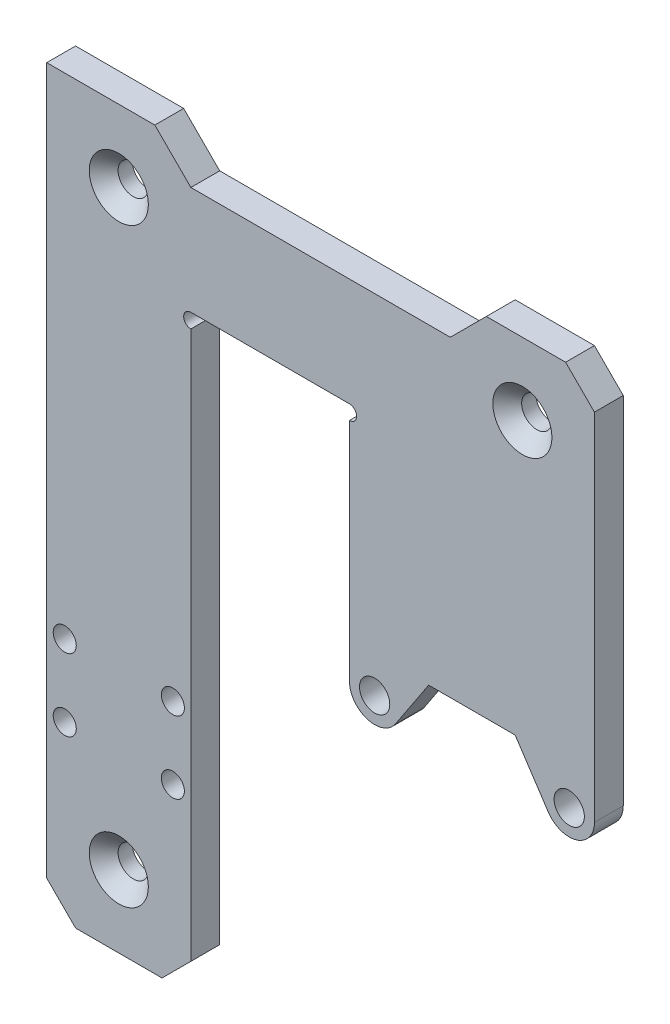
ISO-10303-21;
HEADER;
FILE_DESCRIPTION(('STEP AP214'),'2;1');
FILE_NAME('part.step','',(''),(''),'','','');
FILE_SCHEMA(('AUTOMOTIVE_DESIGN { 1 0 10303 214 1 1 1 1 }'));
ENDSEC;
DATA;
#1=APPLICATION_CONTEXT('core data for automotive mechanical design processes');
#2=APPLICATION_PROTOCOL_DEFINITION('international standard','automotive_design',2000,#1);
#3=PRODUCT_CONTEXT('',#1,'mechanical');
#4=PRODUCT('Part','Part','',(#3));
#5=PRODUCT_RELATED_PRODUCT_CATEGORY('part','',(#4));
#6=PRODUCT_DEFINITION_FORMATION('','',#4);
#7=PRODUCT_DEFINITION_CONTEXT('part definition',#1,'design');
#8=PRODUCT_DEFINITION('design','',#6,#7);
#9=PRODUCT_DEFINITION_SHAPE('','',#8);
#10=(LENGTH_UNIT() NAMED_UNIT(*) SI_UNIT(.MILLI.,.METRE.));
#11=(NAMED_UNIT(*) PLANE_ANGLE_UNIT() SI_UNIT($,.RADIAN.));
#12=(NAMED_UNIT(*) SI_UNIT($,.STERADIAN.) SOLID_ANGLE_UNIT());
#13=UNCERTAINTY_MEASURE_WITH_UNIT(LENGTH_MEASURE(1.E-05),#10,'distance_accuracy_value','');
#14=(GEOMETRIC_REPRESENTATION_CONTEXT(3) GLOBAL_UNCERTAINTY_ASSIGNED_CONTEXT((#13)) GLOBAL_UNIT_ASSIGNED_CONTEXT((#10,
#11,#12)) REPRESENTATION_CONTEXT('',''));
#15=CARTESIAN_POINT('',(0.,0.,0.));
#16=DIRECTION('',(0.,0.,1.));
#17=DIRECTION('',(1.,0.,0.));
#18=AXIS2_PLACEMENT_3D('',#15,#16,#17);
#19=CARTESIAN_POINT('',(45.,20.,2.));
#20=DIRECTION('',(0.,-1.,0.));
#21=DIRECTION('',(1.,0.,0.));
#22=AXIS2_PLACEMENT_3D('',#19,#20,#21);
#23=PLANE('',#22);
#24=DIRECTION('',(-1.,0.,0.));
#25=VECTOR('',#24,1.);
#26=CARTESIAN_POINT('',(45.,20.,2.));
#27=LINE('',#26,#25);
#28=CARTESIAN_POINT('',(41.,20.,2.));
#29=VERTEX_POINT('',#28);
#30=CARTESIAN_POINT('',(30.0000000000001,20.,2.));
#31=VERTEX_POINT('',#30);
#32=EDGE_CURVE('E265',#29,#31,#27,.T.);
#33=ORIENTED_EDGE('',*,*,#32,.F.);
#34=DIRECTION('',(0.,0.,-1.));
#35=VECTOR('',#34,1.);
#36=CARTESIAN_POINT('',(41.,20.,2.));
#37=LINE('',#36,#35);
#38=CARTESIAN_POINT('',(41.,20.,-2.));
#39=VERTEX_POINT('',#38);
#40=EDGE_CURVE('E48',#29,#39,#37,.T.);
#41=ORIENTED_EDGE('',*,*,#40,.T.);
#42=DIRECTION('',(-1.,0.,0.));
#43=VECTOR('',#42,1.);
#44=CARTESIAN_POINT('',(45.,20.,-2.));
#45=LINE('',#44,#43);
#46=CARTESIAN_POINT('',(30.0000000000001,20.,-2.));
#47=VERTEX_POINT('',#46);
#48=EDGE_CURVE('E263',#39,#47,#45,.T.);
#49=ORIENTED_EDGE('',*,*,#48,.T.);
#50=DIRECTION('',(0.,0.,1.));
#51=VECTOR('',#50,1.);
#52=CARTESIAN_POINT('',(30.0000000000001,20.,-2.));
#53=LINE('',#52,#51);
#54=EDGE_CURVE('E502',#47,#31,#53,.T.);
#55=ORIENTED_EDGE('',*,*,#54,.T.);
#56=EDGE_LOOP('',(#33,#41,#49,#55));
#57=FACE_BOUND('',#56,.T.);
#58=ADVANCED_FACE('F39',(#57),#23,.F.);
#59=CARTESIAN_POINT('',(41.5,-33.3065622090011,2.));
#60=DIRECTION('',(0.,0.,1.));
#61=DIRECTION('',(1.,0.,0.));
#62=AXIS2_PLACEMENT_3D('',#59,#60,#61);
#63=PLANE('',#62);
#64=CARTESIAN_POINT('',(-13.5,-58.,2.));
#65=DIRECTION('',(0.,0.,1.));
#66=DIRECTION('',(1.,0.,0.));
#67=AXIS2_PLACEMENT_3D('',#64,#65,#66);
#68=CIRCLE('',#67,1.6);
#69=CARTESIAN_POINT('',(-11.9,-58.,2.));
#70=VERTEX_POINT('',#69);
#71=EDGE_CURVE('E567',#70,#70,#68,.T.);
#72=ORIENTED_EDGE('',*,*,#71,.F.);
#73=EDGE_LOOP('',(#72));
#74=FACE_BOUND('',#73,.T.);
#75=CARTESIAN_POINT('',(-13.5,-48.,2.));
#76=DIRECTION('',(0.,0.,1.));
#77=DIRECTION('',(1.,0.,0.));
#78=AXIS2_PLACEMENT_3D('',#75,#76,#77);
#79=CIRCLE('',#78,1.6);
#80=CARTESIAN_POINT('',(-11.9,-48.,2.));
#81=VERTEX_POINT('',#80);
#82=EDGE_CURVE('E571',#81,#81,#79,.T.);
#83=ORIENTED_EDGE('',*,*,#82,.F.);
#84=EDGE_LOOP('',(#83));
#85=FACE_BOUND('',#84,.T.);
#86=CARTESIAN_POINT('',(-28.5,-48.,2.));
#87=DIRECTION('',(0.,0.,1.));
#88=DIRECTION('',(1.,0.,0.));
#89=AXIS2_PLACEMENT_3D('',#86,#87,#88);
#90=CIRCLE('',#89,1.6);
#91=CARTESIAN_POINT('',(-26.9,-48.,2.));
#92=VERTEX_POINT('',#91);
#93=EDGE_CURVE('E575',#92,#92,#90,.T.);
#94=ORIENTED_EDGE('',*,*,#93,.F.);
#95=EDGE_LOOP('',(#94));
#96=FACE_BOUND('',#95,.T.);
#97=CARTESIAN_POINT('',(-28.5,-58.,2.));
#98=DIRECTION('',(0.,0.,1.));
#99=DIRECTION('',(1.,0.,0.));
#100=AXIS2_PLACEMENT_3D('',#97,#98,#99);
#101=CIRCLE('',#100,1.6);
#102=CARTESIAN_POINT('',(-26.9,-58.,2.));
#103=VERTEX_POINT('',#102);
#104=EDGE_CURVE('E484',#103,#103,#101,.T.);
#105=ORIENTED_EDGE('',*,*,#104,.F.);
#106=EDGE_LOOP('',(#105));
#107=FACE_BOUND('',#106,.T.);
#108=DIRECTION('',(0.,-1.,0.));
#109=VECTOR('',#108,1.);
#110=CARTESIAN_POINT('',(-31.,20.,2.));
#111=LINE('',#110,#109);
#112=CARTESIAN_POINT('',(-31.,20.,2.));
#113=VERTEX_POINT('',#112);
#114=CARTESIAN_POINT('',(-31.,-78.,2.));
#115=VERTEX_POINT('',#114);
#116=EDGE_CURVE('E378',#113,#115,#111,.T.);
#117=ORIENTED_EDGE('',*,*,#116,.T.);
#118=DIRECTION('',(-0.707106781186546,0.707106781186549,0.));
#119=VECTOR('',#118,1.);
#120=CARTESIAN_POINT('',(-17.0967188954995,-91.9032811045005,2.));
#121=LINE('',#120,#119);
#122=CARTESIAN_POINT('',(-27.,-82.,2.));
#123=VERTEX_POINT('',#122);
#124=EDGE_CURVE('E254',#115,#123,#121,.F.);
#125=ORIENTED_EDGE('',*,*,#124,.T.);
#126=DIRECTION('',(1.,0.,0.));
#127=VECTOR('',#126,1.);
#128=CARTESIAN_POINT('',(-31.,-82.,2.));
#129=LINE('',#128,#127);
#130=CARTESIAN_POINT('',(-15.,-82.,2.));
#131=VERTEX_POINT('',#130);
#132=EDGE_CURVE('E293',#123,#131,#129,.T.);
#133=ORIENTED_EDGE('',*,*,#132,.T.);
#134=DIRECTION('',(-0.707106781186549,-0.707106781186546,0.));
#135=VECTOR('',#134,1.);
#136=CARTESIAN_POINT('',(37.5967188954995,-29.4032811045006,2.));
#137=LINE('',#136,#135);
#138=CARTESIAN_POINT('',(-11.,-78.,2.));
#139=VERTEX_POINT('',#138);
#140=EDGE_CURVE('E55',#131,#139,#137,.F.);
#141=ORIENTED_EDGE('',*,*,#140,.T.);
#142=DIRECTION('',(0.,1.,0.));
#143=VECTOR('',#142,1.);
#144=CARTESIAN_POINT('',(-11.,0.,2.));
#145=LINE('',#144,#143);
#146=CARTESIAN_POINT('',(-11.,-2.,2.));
#147=VERTEX_POINT('',#146);
#148=EDGE_CURVE('E205',#139,#147,#145,.T.);
#149=ORIENTED_EDGE('',*,*,#148,.T.);
#150=CARTESIAN_POINT('',(-11.,-1.,2.));
#151=DIRECTION('',(0.,0.,1.));
#152=DIRECTION('',(1.,0.,0.));
#153=AXIS2_PLACEMENT_3D('',#150,#151,#152);
#154=CIRCLE('',#153,1.);
#155=CARTESIAN_POINT('',(-11.,0.,2.));
#156=VERTEX_POINT('',#155);
#157=EDGE_CURVE('E201',#156,#147,#154,.T.);
#158=ORIENTED_EDGE('',*,*,#157,.F.);
#159=DIRECTION('',(1.,0.,0.));
#160=VECTOR('',#159,1.);
#161=CARTESIAN_POINT('',(11.,0.,2.));
#162=LINE('',#161,#160);
#163=CARTESIAN_POINT('',(11.,0.,2.));
#164=VERTEX_POINT('',#163);
#165=EDGE_CURVE('E196',#156,#164,#162,.T.);
#166=ORIENTED_EDGE('',*,*,#165,.T.);
#167=CARTESIAN_POINT('',(11.,-0.999999999999996,2.));
#168=DIRECTION('',(0.,0.,1.));
#169=DIRECTION('',(1.,0.,0.));
#170=AXIS2_PLACEMENT_3D('',#167,#168,#169);
#171=CIRCLE('',#170,1.);
#172=CARTESIAN_POINT('',(11.,-2.,2.));
#173=VERTEX_POINT('',#172);
#174=EDGE_CURVE('E182',#173,#164,#171,.T.);
#175=ORIENTED_EDGE('',*,*,#174,.F.);
#176=DIRECTION('',(0.,-1.,0.));
#177=VECTOR('',#176,1.);
#178=CARTESIAN_POINT('',(11.,0.,2.));
#179=LINE('',#178,#177);
#180=CARTESIAN_POINT('',(11.,-33.3065622090011,2.));
#181=VERTEX_POINT('',#180);
#182=EDGE_CURVE('E204',#173,#181,#179,.T.);
#183=ORIENTED_EDGE('',*,*,#182,.T.);
#184=CARTESIAN_POINT('',(14.5,-33.3065622090011,2.));
#185=DIRECTION('',(0.,0.,1.));
#186=DIRECTION('',(1.,0.,0.));
#187=AXIS2_PLACEMENT_3D('',#184,#185,#186);
#188=CIRCLE('',#187,3.5);
#189=CARTESIAN_POINT('',(17.4198882166285,-35.2363945339439,2.));
#190=VERTEX_POINT('',#189);
#191=EDGE_CURVE('E392',#181,#190,#188,.T.);
#192=ORIENTED_EDGE('',*,*,#191,.T.);
#193=DIRECTION('',(0.551380664269361,0.834253776179574,0.));
#194=VECTOR('',#193,1.);
#195=CARTESIAN_POINT('',(17.4198882166285,-35.2363945339439,2.));
#196=LINE('',#195,#194);
#197=CARTESIAN_POINT('',(22.,-28.3065622090011,2.));
#198=VERTEX_POINT('',#197);
#199=EDGE_CURVE('E312',#190,#198,#196,.T.);
#200=ORIENTED_EDGE('',*,*,#199,.T.);
#201=DIRECTION('',(1.,0.,0.));
#202=VECTOR('',#201,1.);
#203=CARTESIAN_POINT('',(22.,-28.3065622090011,2.));
#204=LINE('',#203,#202);
#205=CARTESIAN_POINT('',(34.,-28.3065622090011,2.));
#206=VERTEX_POINT('',#205);
#207=EDGE_CURVE('E394',#198,#206,#204,.T.);
#208=ORIENTED_EDGE('',*,*,#207,.T.);
#209=DIRECTION('',(0.551380664269361,-0.834253776179574,0.));
#210=VECTOR('',#209,1.);
#211=CARTESIAN_POINT('',(38.5801117833715,-35.2363945339439,2.));
#212=LINE('',#211,#210);
#213=CARTESIAN_POINT('',(38.5801117833715,-35.2363945339439,2.));
#214=VERTEX_POINT('',#213);
#215=EDGE_CURVE('E399',#206,#214,#212,.T.);
#216=ORIENTED_EDGE('',*,*,#215,.T.);
#217=CARTESIAN_POINT('',(41.5,-33.3065622090011,2.));
#218=DIRECTION('',(0.,0.,1.));
#219=DIRECTION('',(1.,0.,0.));
#220=AXIS2_PLACEMENT_3D('',#217,#218,#219);
#221=CIRCLE('',#220,3.5);
#222=CARTESIAN_POINT('',(45.,-33.3065622090011,2.));
#223=VERTEX_POINT('',#222);
#224=EDGE_CURVE('E379',#214,#223,#221,.T.);
#225=ORIENTED_EDGE('',*,*,#224,.T.);
#226=DIRECTION('',(0.,1.,0.));
#227=VECTOR('',#226,1.);
#228=CARTESIAN_POINT('',(45.,-33.3065622090011,2.));
#229=LINE('',#228,#227);
#230=CARTESIAN_POINT('',(45.,16.,2.));
#231=VERTEX_POINT('',#230);
#232=EDGE_CURVE('E376',#223,#231,#229,.T.);
#233=ORIENTED_EDGE('',*,*,#232,.T.);
#234=DIRECTION('',(0.707106781186546,-0.707106781186549,0.));
#235=VECTOR('',#234,1.);
#236=CARTESIAN_POINT('',(67.9032811045006,-6.90328110450067,2.));
#237=LINE('',#236,#235);
#238=EDGE_CURVE('E62',#231,#29,#237,.F.);
#239=ORIENTED_EDGE('',*,*,#238,.T.);
#240=ORIENTED_EDGE('',*,*,#32,.T.);
#241=DIRECTION('',(0.707106781186552,0.707106781186543,0.));
#242=VECTOR('',#241,1.);
#243=CARTESIAN_POINT('',(25.,15.,2.));
#244=LINE('',#243,#242);
#245=CARTESIAN_POINT('',(25.,15.,2.));
#246=VERTEX_POINT('',#245);
#247=EDGE_CURVE('E492',#246,#31,#244,.T.);
#248=ORIENTED_EDGE('',*,*,#247,.F.);
#249=DIRECTION('',(1.,0.,0.));
#250=VECTOR('',#249,1.);
#251=CARTESIAN_POINT('',(-11.,15.,2.));
#252=LINE('',#251,#250);
#253=CARTESIAN_POINT('',(-11.,15.,2.));
#254=VERTEX_POINT('',#253);
#255=EDGE_CURVE('E497',#254,#246,#252,.T.);
#256=ORIENTED_EDGE('',*,*,#255,.F.);
#257=DIRECTION('',(0.707106781186552,-0.707106781186544,0.));
#258=VECTOR('',#257,1.);
#259=CARTESIAN_POINT('',(-16.0000000000001,20.,2.));
#260=LINE('',#259,#258);
#261=CARTESIAN_POINT('',(-16.0000000000001,20.,2.));
#262=VERTEX_POINT('',#261);
#263=EDGE_CURVE('E480',#262,#254,#260,.T.);
#264=ORIENTED_EDGE('',*,*,#263,.F.);
#265=EDGE_CURVE('E371',#262,#113,#27,.T.);
#266=ORIENTED_EDGE('',*,*,#265,.T.);
#267=EDGE_LOOP('',(#117,#125,#133,#141,#149,#158,#166,#175,#183,#192,#200,#208,#216,#225,#233,
#239,#240,#248,#256,#264,#266));
#268=FACE_BOUND('',#267,.T.);
#269=CARTESIAN_POINT('',(-21.,-72.,2.));
#270=DIRECTION('',(0.,0.,1.));
#271=DIRECTION('',(1.,0.,0.));
#272=AXIS2_PLACEMENT_3D('',#269,#270,#271);
#273=CIRCLE('',#272,4.10000000000002);
#274=CARTESIAN_POINT('',(-16.9,-72.,2.));
#275=VERTEX_POINT('',#274);
#276=EDGE_CURVE('E229',#275,#275,#273,.F.);
#277=ORIENTED_EDGE('',*,*,#276,.T.);
#278=EDGE_LOOP('',(#277));
#279=FACE_BOUND('',#278,.T.);
#280=CARTESIAN_POINT('',(35.,10.,2.));
#281=DIRECTION('',(0.,0.,1.));
#282=DIRECTION('',(1.,0.,0.));
#283=AXIS2_PLACEMENT_3D('',#280,#281,#282);
#284=CIRCLE('',#283,4.10000000000002);
#285=CARTESIAN_POINT('',(39.1,10.,2.));
#286=VERTEX_POINT('',#285);
#287=EDGE_CURVE('E226',#286,#286,#284,.F.);
#288=ORIENTED_EDGE('',*,*,#287,.T.);
#289=EDGE_LOOP('',(#288));
#290=FACE_BOUND('',#289,.T.);
#291=CARTESIAN_POINT('',(-21.,10.,2.));
#292=DIRECTION('',(0.,0.,1.));
#293=DIRECTION('',(1.,0.,0.));
#294=AXIS2_PLACEMENT_3D('',#291,#292,#293);
#295=CIRCLE('',#294,4.10000000000002);
#296=CARTESIAN_POINT('',(-16.9,10.,2.));
#297=VERTEX_POINT('',#296);
#298=EDGE_CURVE('E223',#297,#297,#295,.F.);
#299=ORIENTED_EDGE('',*,*,#298,.T.);
#300=EDGE_LOOP('',(#299));
#301=FACE_BOUND('',#300,.T.);
#302=CARTESIAN_POINT('',(41.5,-33.3065622090011,2.));
#303=DIRECTION('',(0.,0.,1.));
#304=DIRECTION('',(1.,0.,0.));
#305=AXIS2_PLACEMENT_3D('',#302,#303,#304);
#306=CIRCLE('',#305,2.1);
#307=CARTESIAN_POINT('',(43.6,-33.3065622090011,2.));
#308=VERTEX_POINT('',#307);
#309=EDGE_CURVE('E513',#308,#308,#306,.T.);
#310=ORIENTED_EDGE('',*,*,#309,.F.);
#311=EDGE_LOOP('',(#310));
#312=FACE_BOUND('',#311,.T.);
#313=CARTESIAN_POINT('',(14.5,-33.3065622090011,2.));
#314=DIRECTION('',(0.,0.,1.));
#315=DIRECTION('',(1.,0.,0.));
#316=AXIS2_PLACEMENT_3D('',#313,#314,#315);
#317=CIRCLE('',#316,2.09999999999999);
#318=CARTESIAN_POINT('',(16.6,-33.3065622090011,2.));
#319=VERTEX_POINT('',#318);
#320=EDGE_CURVE('E519',#319,#319,#317,.T.);
#321=ORIENTED_EDGE('',*,*,#320,.F.);
#322=EDGE_LOOP('',(#321));
#323=FACE_BOUND('',#322,.T.);
#324=ADVANCED_FACE('F198',(#74,#85,#96,#107,#268,#279,#290,#301,#312,#323),#63,.T.);
#325=CARTESIAN_POINT('',(41.5,-33.3065622090011,-2.));
#326=DIRECTION('',(0.,0.,1.));
#327=DIRECTION('',(1.,0.,0.));
#328=AXIS2_PLACEMENT_3D('',#325,#326,#327);
#329=PLANE('',#328);
#330=CARTESIAN_POINT('',(-13.5,-58.,-2.));
#331=DIRECTION('',(0.,0.,1.));
#332=DIRECTION('',(1.,0.,0.));
#333=AXIS2_PLACEMENT_3D('',#330,#331,#332);
#334=CIRCLE('',#333,1.6);
#335=CARTESIAN_POINT('',(-11.9,-58.,-2.));
#336=VERTEX_POINT('',#335);
#337=EDGE_CURVE('E554',#336,#336,#334,.T.);
#338=ORIENTED_EDGE('',*,*,#337,.T.);
#339=EDGE_LOOP('',(#338));
#340=FACE_BOUND('',#339,.T.);
#341=CARTESIAN_POINT('',(-13.5,-48.,-2.));
#342=DIRECTION('',(0.,0.,1.));
#343=DIRECTION('',(1.,0.,0.));
#344=AXIS2_PLACEMENT_3D('',#341,#342,#343);
#345=CIRCLE('',#344,1.6);
#346=CARTESIAN_POINT('',(-11.9,-48.,-2.));
#347=VERTEX_POINT('',#346);
#348=EDGE_CURVE('E558',#347,#347,#345,.T.);
#349=ORIENTED_EDGE('',*,*,#348,.T.);
#350=EDGE_LOOP('',(#349));
#351=FACE_BOUND('',#350,.T.);
#352=CARTESIAN_POINT('',(-28.5,-48.,-2.));
#353=DIRECTION('',(0.,0.,1.));
#354=DIRECTION('',(1.,0.,0.));
#355=AXIS2_PLACEMENT_3D('',#352,#353,#354);
#356=CIRCLE('',#355,1.6);
#357=CARTESIAN_POINT('',(-26.9,-48.,-2.));
#358=VERTEX_POINT('',#357);
#359=EDGE_CURVE('E562',#358,#358,#356,.T.);
#360=ORIENTED_EDGE('',*,*,#359,.T.);
#361=EDGE_LOOP('',(#360));
#362=FACE_BOUND('',#361,.T.);
#363=CARTESIAN_POINT('',(-28.5,-58.,-2.));
#364=DIRECTION('',(0.,0.,1.));
#365=DIRECTION('',(1.,0.,0.));
#366=AXIS2_PLACEMENT_3D('',#363,#364,#365);
#367=CIRCLE('',#366,1.6);
#368=CARTESIAN_POINT('',(-26.9,-58.,-2.));
#369=VERTEX_POINT('',#368);
#370=EDGE_CURVE('E192',#369,#369,#367,.T.);
#371=ORIENTED_EDGE('',*,*,#370,.T.);
#372=EDGE_LOOP('',(#371));
#373=FACE_BOUND('',#372,.T.);
#374=DIRECTION('',(1.,0.,0.));
#375=VECTOR('',#374,1.);
#376=CARTESIAN_POINT('',(-31.,-82.,-2.));
#377=LINE('',#376,#375);
#378=CARTESIAN_POINT('',(-27.,-82.,-2.));
#379=VERTEX_POINT('',#378);
#380=CARTESIAN_POINT('',(-15.,-82.,-2.));
#381=VERTEX_POINT('',#380);
#382=EDGE_CURVE('E281',#379,#381,#377,.T.);
#383=ORIENTED_EDGE('',*,*,#382,.F.);
#384=DIRECTION('',(0.707106781186546,-0.707106781186549,0.));
#385=VECTOR('',#384,1.);
#386=CARTESIAN_POINT('',(-27.,-82.,-2.));
#387=LINE('',#386,#385);
#388=CARTESIAN_POINT('',(-31.,-78.,-2.));
#389=VERTEX_POINT('',#388);
#390=EDGE_CURVE('E248',#379,#389,#387,.F.);
#391=ORIENTED_EDGE('',*,*,#390,.T.);
#392=DIRECTION('',(0.,-1.,0.));
#393=VECTOR('',#392,1.);
#394=CARTESIAN_POINT('',(-31.,20.,-2.));
#395=LINE('',#394,#393);
#396=CARTESIAN_POINT('',(-31.,20.,-2.));
#397=VERTEX_POINT('',#396);
#398=EDGE_CURVE('E277',#397,#389,#395,.T.);
#399=ORIENTED_EDGE('',*,*,#398,.F.);
#400=CARTESIAN_POINT('',(-16.0000000000001,20.,-2.));
#401=VERTEX_POINT('',#400);
#402=EDGE_CURVE('E278',#401,#397,#45,.T.);
#403=ORIENTED_EDGE('',*,*,#402,.F.);
#404=DIRECTION('',(0.707106781186552,-0.707106781186544,0.));
#405=VECTOR('',#404,1.);
#406=CARTESIAN_POINT('',(-16.0000000000001,20.,-2.));
#407=LINE('',#406,#405);
#408=CARTESIAN_POINT('',(-11.,15.,-2.));
#409=VERTEX_POINT('',#408);
#410=EDGE_CURVE('E488',#401,#409,#407,.T.);
#411=ORIENTED_EDGE('',*,*,#410,.T.);
#412=DIRECTION('',(1.,0.,0.));
#413=VECTOR('',#412,1.);
#414=CARTESIAN_POINT('',(-11.,15.,-2.));
#415=LINE('',#414,#413);
#416=CARTESIAN_POINT('',(25.,15.,-2.));
#417=VERTEX_POINT('',#416);
#418=EDGE_CURVE('E491',#409,#417,#415,.T.);
#419=ORIENTED_EDGE('',*,*,#418,.T.);
#420=DIRECTION('',(0.707106781186552,0.707106781186543,0.));
#421=VECTOR('',#420,1.);
#422=CARTESIAN_POINT('',(25.,15.,-2.));
#423=LINE('',#422,#421);
#424=EDGE_CURVE('E276',#417,#47,#423,.T.);
#425=ORIENTED_EDGE('',*,*,#424,.T.);
#426=ORIENTED_EDGE('',*,*,#48,.F.);
#427=DIRECTION('',(-0.707106781186546,0.707106781186549,0.));
#428=VECTOR('',#427,1.);
#429=CARTESIAN_POINT('',(41.,20.,-2.));
#430=LINE('',#429,#428);
#431=CARTESIAN_POINT('',(45.,16.,-2.));
#432=VERTEX_POINT('',#431);
#433=EDGE_CURVE('E244',#39,#432,#430,.F.);
#434=ORIENTED_EDGE('',*,*,#433,.T.);
#435=DIRECTION('',(0.,1.,0.));
#436=VECTOR('',#435,1.);
#437=CARTESIAN_POINT('',(45.,-33.3065622090011,-2.));
#438=LINE('',#437,#436);
#439=CARTESIAN_POINT('',(45.,-33.3065622090011,-2.));
#440=VERTEX_POINT('',#439);
#441=EDGE_CURVE('E283',#440,#432,#438,.T.);
#442=ORIENTED_EDGE('',*,*,#441,.F.);
#443=CARTESIAN_POINT('',(41.5,-33.3065622090011,-2.));
#444=DIRECTION('',(0.,0.,1.));
#445=DIRECTION('',(1.,0.,0.));
#446=AXIS2_PLACEMENT_3D('',#443,#444,#445);
#447=CIRCLE('',#446,3.5);
#448=CARTESIAN_POINT('',(38.5801117833715,-35.2363945339439,-2.));
#449=VERTEX_POINT('',#448);
#450=EDGE_CURVE('E328',#449,#440,#447,.T.);
#451=ORIENTED_EDGE('',*,*,#450,.F.);
#452=DIRECTION('',(0.551380664269361,-0.834253776179574,0.));
#453=VECTOR('',#452,1.);
#454=CARTESIAN_POINT('',(38.5801117833715,-35.2363945339439,-2.));
#455=LINE('',#454,#453);
#456=CARTESIAN_POINT('',(34.,-28.3065622090011,-2.));
#457=VERTEX_POINT('',#456);
#458=EDGE_CURVE('E322',#457,#449,#455,.T.);
#459=ORIENTED_EDGE('',*,*,#458,.F.);
#460=DIRECTION('',(1.,0.,0.));
#461=VECTOR('',#460,1.);
#462=CARTESIAN_POINT('',(22.,-28.3065622090011,-2.));
#463=LINE('',#462,#461);
#464=CARTESIAN_POINT('',(22.,-28.3065622090011,-2.));
#465=VERTEX_POINT('',#464);
#466=EDGE_CURVE('E320',#465,#457,#463,.T.);
#467=ORIENTED_EDGE('',*,*,#466,.F.);
#468=DIRECTION('',(0.551380664269361,0.834253776179574,0.));
#469=VECTOR('',#468,1.);
#470=CARTESIAN_POINT('',(17.4198882166285,-35.2363945339439,-2.));
#471=LINE('',#470,#469);
#472=CARTESIAN_POINT('',(17.4198882166285,-35.2363945339439,-2.));
#473=VERTEX_POINT('',#472);
#474=EDGE_CURVE('E311',#473,#465,#471,.T.);
#475=ORIENTED_EDGE('',*,*,#474,.F.);
#476=CARTESIAN_POINT('',(14.5,-33.3065622090011,-2.));
#477=DIRECTION('',(0.,0.,1.));
#478=DIRECTION('',(1.,0.,0.));
#479=AXIS2_PLACEMENT_3D('',#476,#477,#478);
#480=CIRCLE('',#479,3.5);
#481=CARTESIAN_POINT('',(11.,-33.3065622090011,-2.));
#482=VERTEX_POINT('',#481);
#483=EDGE_CURVE('E318',#482,#473,#480,.T.);
#484=ORIENTED_EDGE('',*,*,#483,.F.);
#485=DIRECTION('',(0.,-1.,0.));
#486=VECTOR('',#485,1.);
#487=CARTESIAN_POINT('',(11.,0.,-2.));
#488=LINE('',#487,#486);
#489=CARTESIAN_POINT('',(11.,-2.,-2.));
#490=VERTEX_POINT('',#489);
#491=EDGE_CURVE('E324',#490,#482,#488,.T.);
#492=ORIENTED_EDGE('',*,*,#491,.F.);
#493=CARTESIAN_POINT('',(11.,-0.999999999999996,-2.));
#494=DIRECTION('',(0.,0.,1.));
#495=DIRECTION('',(1.,0.,0.));
#496=AXIS2_PLACEMENT_3D('',#493,#494,#495);
#497=CIRCLE('',#496,1.);
#498=CARTESIAN_POINT('',(11.,0.,-2.));
#499=VERTEX_POINT('',#498);
#500=EDGE_CURVE('E191',#490,#499,#497,.T.);
#501=ORIENTED_EDGE('',*,*,#500,.T.);
#502=DIRECTION('',(1.,0.,0.));
#503=VECTOR('',#502,1.);
#504=CARTESIAN_POINT('',(11.,0.,-2.));
#505=LINE('',#504,#503);
#506=CARTESIAN_POINT('',(-11.,0.,-2.));
#507=VERTEX_POINT('',#506);
#508=EDGE_CURVE('E210',#507,#499,#505,.T.);
#509=ORIENTED_EDGE('',*,*,#508,.F.);
#510=CARTESIAN_POINT('',(-11.,-1.,-2.));
#511=DIRECTION('',(0.,0.,1.));
#512=DIRECTION('',(1.,0.,0.));
#513=AXIS2_PLACEMENT_3D('',#510,#511,#512);
#514=CIRCLE('',#513,1.);
#515=CARTESIAN_POINT('',(-11.,-2.,-2.));
#516=VERTEX_POINT('',#515);
#517=EDGE_CURVE('E477',#507,#516,#514,.T.);
#518=ORIENTED_EDGE('',*,*,#517,.T.);
#519=DIRECTION('',(0.,1.,0.));
#520=VECTOR('',#519,1.);
#521=CARTESIAN_POINT('',(-11.,0.,-2.));
#522=LINE('',#521,#520);
#523=CARTESIAN_POINT('',(-11.,-78.,-2.));
#524=VERTEX_POINT('',#523);
#525=EDGE_CURVE('E385',#524,#516,#522,.T.);
#526=ORIENTED_EDGE('',*,*,#525,.F.);
#527=DIRECTION('',(0.707106781186549,0.707106781186546,0.));
#528=VECTOR('',#527,1.);
#529=CARTESIAN_POINT('',(-11.,-78.,-2.));
#530=LINE('',#529,#528);
#531=EDGE_CURVE('E246',#524,#381,#530,.F.);
#532=ORIENTED_EDGE('',*,*,#531,.T.);
#533=EDGE_LOOP('',(#383,#391,#399,#403,#411,#419,#425,#426,#434,#442,#451,#459,#467,#475,#484,
#492,#501,#509,#518,#526,#532));
#534=FACE_BOUND('',#533,.T.);
#535=CARTESIAN_POINT('',(-21.,10.,-2.));
#536=DIRECTION('',(0.,0.,1.));
#537=DIRECTION('',(1.,0.,0.));
#538=AXIS2_PLACEMENT_3D('',#535,#536,#537);
#539=CIRCLE('',#538,2.1);
#540=CARTESIAN_POINT('',(-18.9,10.,-2.));
#541=VERTEX_POINT('',#540);
#542=EDGE_CURVE('E387',#541,#541,#539,.T.);
#543=ORIENTED_EDGE('',*,*,#542,.T.);
#544=EDGE_LOOP('',(#543));
#545=FACE_BOUND('',#544,.T.);
#546=CARTESIAN_POINT('',(35.,10.,-2.));
#547=DIRECTION('',(0.,0.,1.));
#548=DIRECTION('',(1.,0.,0.));
#549=AXIS2_PLACEMENT_3D('',#546,#547,#548);
#550=CIRCLE('',#549,2.1);
#551=CARTESIAN_POINT('',(37.1,10.,-2.));
#552=VERTEX_POINT('',#551);
#553=EDGE_CURVE('E522',#552,#552,#550,.T.);
#554=ORIENTED_EDGE('',*,*,#553,.T.);
#555=EDGE_LOOP('',(#554));
#556=FACE_BOUND('',#555,.T.);
#557=CARTESIAN_POINT('',(14.5,-33.3065622090011,-2.));
#558=DIRECTION('',(0.,0.,1.));
#559=DIRECTION('',(1.,0.,0.));
#560=AXIS2_PLACEMENT_3D('',#557,#558,#559);
#561=CIRCLE('',#560,2.09999999999999);
#562=CARTESIAN_POINT('',(16.6,-33.3065622090011,-2.));
#563=VERTEX_POINT('',#562);
#564=EDGE_CURVE('E516',#563,#563,#561,.T.);
#565=ORIENTED_EDGE('',*,*,#564,.T.);
#566=EDGE_LOOP('',(#565));
#567=FACE_BOUND('',#566,.T.);
#568=CARTESIAN_POINT('',(41.5,-33.3065622090011,-2.));
#569=DIRECTION('',(0.,0.,1.));
#570=DIRECTION('',(1.,0.,0.));
#571=AXIS2_PLACEMENT_3D('',#568,#569,#570);
#572=CIRCLE('',#571,2.1);
#573=CARTESIAN_POINT('',(43.6,-33.3065622090011,-2.));
#574=VERTEX_POINT('',#573);
#575=EDGE_CURVE('E512',#574,#574,#572,.T.);
#576=ORIENTED_EDGE('',*,*,#575,.T.);
#577=EDGE_LOOP('',(#576));
#578=FACE_BOUND('',#577,.T.);
#579=CARTESIAN_POINT('',(-21.,-72.,-2.));
#580=DIRECTION('',(0.,0.,1.));
#581=DIRECTION('',(1.,0.,0.));
#582=AXIS2_PLACEMENT_3D('',#579,#580,#581);
#583=CIRCLE('',#582,2.1);
#584=CARTESIAN_POINT('',(-18.9,-72.,-2.));
#585=VERTEX_POINT('',#584);
#586=EDGE_CURVE('E504',#585,#585,#583,.T.);
#587=ORIENTED_EDGE('',*,*,#586,.T.);
#588=EDGE_LOOP('',(#587));
#589=FACE_BOUND('',#588,.T.);
#590=ADVANCED_FACE('F270',(#340,#351,#362,#373,#534,#545,#556,#567,#578,#589),#329,.F.);
#591=CARTESIAN_POINT('',(-11.,0.,2.));
#592=DIRECTION('',(-1.,0.,0.));
#593=DIRECTION('',(0.,-1.,0.));
#594=AXIS2_PLACEMENT_3D('',#591,#592,#593);
#595=PLANE('',#594);
#596=ORIENTED_EDGE('',*,*,#148,.F.);
#597=DIRECTION('',(0.,0.,-1.));
#598=VECTOR('',#597,1.);
#599=CARTESIAN_POINT('',(-11.,-78.,2.));
#600=LINE('',#599,#598);
#601=EDGE_CURVE('E256',#139,#524,#600,.T.);
#602=ORIENTED_EDGE('',*,*,#601,.T.);
#603=ORIENTED_EDGE('',*,*,#525,.T.);
#604=DIRECTION('',(0.,0.,1.));
#605=VECTOR('',#604,1.);
#606=CARTESIAN_POINT('',(-11.,-2.,-2.));
#607=LINE('',#606,#605);
#608=EDGE_CURVE('E478',#516,#147,#607,.T.);
#609=ORIENTED_EDGE('',*,*,#608,.T.);
#610=EDGE_LOOP('',(#596,#602,#603,#609));
#611=FACE_BOUND('',#610,.T.);
#612=ADVANCED_FACE('F424',(#611),#595,.F.);
#613=CARTESIAN_POINT('',(11.,0.,2.));
#614=DIRECTION('',(0.,1.,0.));
#615=DIRECTION('',(-1.,0.,0.));
#616=AXIS2_PLACEMENT_3D('',#613,#614,#615);
#617=PLANE('',#616);
#618=ORIENTED_EDGE('',*,*,#508,.T.);
#619=DIRECTION('',(0.,0.,-1.));
#620=VECTOR('',#619,1.);
#621=CARTESIAN_POINT('',(11.,0.,2.));
#622=LINE('',#621,#620);
#623=EDGE_CURVE('E186',#164,#499,#622,.T.);
#624=ORIENTED_EDGE('',*,*,#623,.F.);
#625=ORIENTED_EDGE('',*,*,#165,.F.);
#626=DIRECTION('',(0.,0.,-1.));
#627=VECTOR('',#626,1.);
#628=CARTESIAN_POINT('',(-11.,0.,2.));
#629=LINE('',#628,#627);
#630=EDGE_CURVE('E211',#156,#507,#629,.T.);
#631=ORIENTED_EDGE('',*,*,#630,.T.);
#632=EDGE_LOOP('',(#618,#624,#625,#631));
#633=FACE_BOUND('',#632,.T.);
#634=ADVANCED_FACE('F208',(#633),#617,.F.);
#635=CARTESIAN_POINT('',(11.,0.,2.));
#636=DIRECTION('',(1.,0.,0.));
#637=DIRECTION('',(0.,1.,0.));
#638=AXIS2_PLACEMENT_3D('',#635,#636,#637);
#639=PLANE('',#638);
#640=ORIENTED_EDGE('',*,*,#182,.F.);
#641=DIRECTION('',(0.,0.,1.));
#642=VECTOR('',#641,1.);
#643=CARTESIAN_POINT('',(11.,-2.,-2.));
#644=LINE('',#643,#642);
#645=EDGE_CURVE('E189',#173,#490,#644,.F.);
#646=ORIENTED_EDGE('',*,*,#645,.T.);
#647=ORIENTED_EDGE('',*,*,#491,.T.);
#648=DIRECTION('',(0.,0.,-1.));
#649=VECTOR('',#648,1.);
#650=CARTESIAN_POINT('',(11.,-33.3065622090011,2.));
#651=LINE('',#650,#649);
#652=EDGE_CURVE('E212',#181,#482,#651,.T.);
#653=ORIENTED_EDGE('',*,*,#652,.F.);
#654=EDGE_LOOP('',(#640,#646,#647,#653));
#655=FACE_BOUND('',#654,.T.);
#656=ADVANCED_FACE('F390',(#655),#639,.F.);
#657=CARTESIAN_POINT('',(14.5,-33.3065622090011,2.));
#658=DIRECTION('',(0.,0.,-1.));
#659=DIRECTION('',(-1.,0.,0.));
#660=AXIS2_PLACEMENT_3D('',#657,#658,#659);
#661=CYLINDRICAL_SURFACE('',#660,3.5);
#662=ORIENTED_EDGE('',*,*,#483,.T.);
#663=DIRECTION('',(0.,0.,-1.));
#664=VECTOR('',#663,1.);
#665=CARTESIAN_POINT('',(17.4198882166285,-35.2363945339439,2.));
#666=LINE('',#665,#664);
#667=EDGE_CURVE('E217',#190,#473,#666,.T.);
#668=ORIENTED_EDGE('',*,*,#667,.F.);
#669=ORIENTED_EDGE('',*,*,#191,.F.);
#670=ORIENTED_EDGE('',*,*,#652,.T.);
#671=EDGE_LOOP('',(#662,#668,#669,#670));
#672=FACE_BOUND('',#671,.T.);
#673=ADVANCED_FACE('F391',(#672),#661,.T.);
#674=CARTESIAN_POINT('',(17.4198882166285,-35.2363945339439,2.));
#675=DIRECTION('',(-0.834253776179574,0.551380664269361,0.));
#676=DIRECTION('',(-0.551380664269361,-0.834253776179574,0.));
#677=AXIS2_PLACEMENT_3D('',#674,#675,#676);
#678=PLANE('',#677);
#679=ORIENTED_EDGE('',*,*,#474,.T.);
#680=DIRECTION('',(0.,0.,-1.));
#681=VECTOR('',#680,1.);
#682=CARTESIAN_POINT('',(22.,-28.3065622090011,2.));
#683=LINE('',#682,#681);
#684=EDGE_CURVE('E302',#198,#465,#683,.T.);
#685=ORIENTED_EDGE('',*,*,#684,.F.);
#686=ORIENTED_EDGE('',*,*,#199,.F.);
#687=ORIENTED_EDGE('',*,*,#667,.T.);
#688=EDGE_LOOP('',(#679,#685,#686,#687));
#689=FACE_BOUND('',#688,.T.);
#690=ADVANCED_FACE('F309',(#689),#678,.F.);
#691=CARTESIAN_POINT('',(22.,-28.3065622090011,2.));
#692=DIRECTION('',(0.,1.,0.));
#693=DIRECTION('',(0.,0.,1.));
#694=AXIS2_PLACEMENT_3D('',#691,#692,#693);
#695=PLANE('',#694);
#696=ORIENTED_EDGE('',*,*,#466,.T.);
#697=DIRECTION('',(0.,0.,-1.));
#698=VECTOR('',#697,1.);
#699=CARTESIAN_POINT('',(34.,-28.3065622090011,2.));
#700=LINE('',#699,#698);
#701=EDGE_CURVE('E299',#206,#457,#700,.T.);
#702=ORIENTED_EDGE('',*,*,#701,.F.);
#703=ORIENTED_EDGE('',*,*,#207,.F.);
#704=ORIENTED_EDGE('',*,*,#684,.T.);
#705=EDGE_LOOP('',(#696,#702,#703,#704));
#706=FACE_BOUND('',#705,.T.);
#707=ADVANCED_FACE('F409',(#706),#695,.F.);
#708=CARTESIAN_POINT('',(38.5801117833715,-35.2363945339439,2.));
#709=DIRECTION('',(0.834253776179574,0.551380664269361,0.));
#710=DIRECTION('',(-0.551380664269361,0.834253776179574,0.));
#711=AXIS2_PLACEMENT_3D('',#708,#709,#710);
#712=PLANE('',#711);
#713=ORIENTED_EDGE('',*,*,#458,.T.);
#714=DIRECTION('',(0.,0.,-1.));
#715=VECTOR('',#714,1.);
#716=CARTESIAN_POINT('',(38.5801117833715,-35.2363945339439,2.));
#717=LINE('',#716,#715);
#718=EDGE_CURVE('E296',#214,#449,#717,.T.);
#719=ORIENTED_EDGE('',*,*,#718,.F.);
#720=ORIENTED_EDGE('',*,*,#215,.F.);
#721=ORIENTED_EDGE('',*,*,#701,.T.);
#722=EDGE_LOOP('',(#713,#719,#720,#721));
#723=FACE_BOUND('',#722,.T.);
#724=ADVANCED_FACE('F404',(#723),#712,.F.);
#725=CARTESIAN_POINT('',(41.5,-33.3065622090011,2.));
#726=DIRECTION('',(0.,0.,-1.));
#727=DIRECTION('',(-1.,0.,0.));
#728=AXIS2_PLACEMENT_3D('',#725,#726,#727);
#729=CYLINDRICAL_SURFACE('',#728,3.5);
#730=ORIENTED_EDGE('',*,*,#450,.T.);
#731=DIRECTION('',(0.,0.,-1.));
#732=VECTOR('',#731,1.);
#733=CARTESIAN_POINT('',(45.,-33.3065622090011,2.));
#734=LINE('',#733,#732);
#735=EDGE_CURVE('E292',#223,#440,#734,.T.);
#736=ORIENTED_EDGE('',*,*,#735,.F.);
#737=ORIENTED_EDGE('',*,*,#224,.F.);
#738=ORIENTED_EDGE('',*,*,#718,.T.);
#739=EDGE_LOOP('',(#730,#736,#737,#738));
#740=FACE_BOUND('',#739,.T.);
#741=ADVANCED_FACE('F367',(#740),#729,.T.);
#742=CARTESIAN_POINT('',(45.,-33.3065622090011,2.));
#743=DIRECTION('',(-1.,0.,0.));
#744=DIRECTION('',(0.,0.,1.));
#745=AXIS2_PLACEMENT_3D('',#742,#743,#744);
#746=PLANE('',#745);
#747=ORIENTED_EDGE('',*,*,#441,.T.);
#748=DIRECTION('',(0.,0.,1.));
#749=VECTOR('',#748,1.);
#750=CARTESIAN_POINT('',(45.,16.,2.));
#751=LINE('',#750,#749);
#752=EDGE_CURVE('E11',#432,#231,#751,.T.);
#753=ORIENTED_EDGE('',*,*,#752,.T.);
#754=ORIENTED_EDGE('',*,*,#232,.F.);
#755=ORIENTED_EDGE('',*,*,#735,.T.);
#756=EDGE_LOOP('',(#747,#753,#754,#755));
#757=FACE_BOUND('',#756,.T.);
#758=ADVANCED_FACE('F334',(#757),#746,.F.);
#759=ORIENTED_EDGE('',*,*,#265,.F.);
#760=DIRECTION('',(0.,0.,1.));
#761=VECTOR('',#760,1.);
#762=CARTESIAN_POINT('',(-16.0000000000001,20.,-2.));
#763=LINE('',#762,#761);
#764=EDGE_CURVE('E372',#401,#262,#763,.T.);
#765=ORIENTED_EDGE('',*,*,#764,.F.);
#766=ORIENTED_EDGE('',*,*,#402,.T.);
#767=DIRECTION('',(0.,0.,-1.));
#768=VECTOR('',#767,1.);
#769=CARTESIAN_POINT('',(-31.,20.,2.));
#770=LINE('',#769,#768);
#771=EDGE_CURVE('E289',#113,#397,#770,.T.);
#772=ORIENTED_EDGE('',*,*,#771,.F.);
#773=EDGE_LOOP('',(#759,#765,#766,#772));
#774=FACE_BOUND('',#773,.T.);
#775=ADVANCED_FACE('F350',(#774),#23,.F.);
#776=CARTESIAN_POINT('',(-31.,20.,2.));
#777=DIRECTION('',(1.,0.,0.));
#778=DIRECTION('',(0.,1.,0.));
#779=AXIS2_PLACEMENT_3D('',#776,#777,#778);
#780=PLANE('',#779);
#781=ORIENTED_EDGE('',*,*,#398,.T.);
#782=DIRECTION('',(0.,0.,1.));
#783=VECTOR('',#782,1.);
#784=CARTESIAN_POINT('',(-31.,-78.,2.));
#785=LINE('',#784,#783);
#786=EDGE_CURVE('E250',#389,#115,#785,.T.);
#787=ORIENTED_EDGE('',*,*,#786,.T.);
#788=ORIENTED_EDGE('',*,*,#116,.F.);
#789=ORIENTED_EDGE('',*,*,#771,.T.);
#790=EDGE_LOOP('',(#781,#787,#788,#789));
#791=FACE_BOUND('',#790,.T.);
#792=ADVANCED_FACE('F359',(#791),#780,.F.);
#793=CARTESIAN_POINT('',(-31.,-82.,2.));
#794=DIRECTION('',(0.,1.,0.));
#795=DIRECTION('',(0.,0.,1.));
#796=AXIS2_PLACEMENT_3D('',#793,#794,#795);
#797=PLANE('',#796);
#798=ORIENTED_EDGE('',*,*,#132,.F.);
#799=DIRECTION('',(0.,0.,-1.));
#800=VECTOR('',#799,1.);
#801=CARTESIAN_POINT('',(-27.,-82.,2.));
#802=LINE('',#801,#800);
#803=EDGE_CURVE('E241',#123,#379,#802,.T.);
#804=ORIENTED_EDGE('',*,*,#803,.T.);
#805=ORIENTED_EDGE('',*,*,#382,.T.);
#806=DIRECTION('',(0.,0.,1.));
#807=VECTOR('',#806,1.);
#808=CARTESIAN_POINT('',(-15.,-82.,2.));
#809=LINE('',#808,#807);
#810=EDGE_CURVE('E239',#381,#131,#809,.T.);
#811=ORIENTED_EDGE('',*,*,#810,.T.);
#812=EDGE_LOOP('',(#798,#804,#805,#811));
#813=FACE_BOUND('',#812,.T.);
#814=ADVANCED_FACE('F365',(#813),#797,.F.);
#815=CARTESIAN_POINT('',(-21.,10.,2.));
#816=DIRECTION('',(0.,0.,-1.));
#817=DIRECTION('',(-1.,0.,0.));
#818=AXIS2_PLACEMENT_3D('',#815,#816,#817);
#819=CYLINDRICAL_SURFACE('',#818,2.1);
#820=CARTESIAN_POINT('',(-21.,10.,0.));
#821=DIRECTION('',(0.,0.,1.));
#822=DIRECTION('',(1.,0.,0.));
#823=AXIS2_PLACEMENT_3D('',#820,#821,#822);
#824=CIRCLE('',#823,2.1);
#825=CARTESIAN_POINT('',(-18.9,10.,0.));
#826=VERTEX_POINT('',#825);
#827=EDGE_CURVE('E235',#826,#826,#824,.T.);
#828=ORIENTED_EDGE('',*,*,#827,.T.);
#829=EDGE_LOOP('',(#828));
#830=FACE_BOUND('',#829,.T.);
#831=ORIENTED_EDGE('',*,*,#542,.F.);
#832=EDGE_LOOP('',(#831));
#833=FACE_BOUND('',#832,.T.);
#834=ADVANCED_FACE('F532',(#830,#833),#819,.F.);
#835=CARTESIAN_POINT('',(35.,10.,2.));
#836=DIRECTION('',(0.,0.,-1.));
#837=DIRECTION('',(-1.,0.,0.));
#838=AXIS2_PLACEMENT_3D('',#835,#836,#837);
#839=CYLINDRICAL_SURFACE('',#838,2.1);
#840=CARTESIAN_POINT('',(35.,10.,0.));
#841=DIRECTION('',(0.,0.,1.));
#842=DIRECTION('',(1.,0.,0.));
#843=AXIS2_PLACEMENT_3D('',#840,#841,#842);
#844=CIRCLE('',#843,2.1);
#845=CARTESIAN_POINT('',(37.1,10.,0.));
#846=VERTEX_POINT('',#845);
#847=EDGE_CURVE('E232',#846,#846,#844,.T.);
#848=ORIENTED_EDGE('',*,*,#847,.T.);
#849=EDGE_LOOP('',(#848));
#850=FACE_BOUND('',#849,.T.);
#851=ORIENTED_EDGE('',*,*,#553,.F.);
#852=EDGE_LOOP('',(#851));
#853=FACE_BOUND('',#852,.T.);
#854=ADVANCED_FACE('F534',(#850,#853),#839,.F.);
#855=CARTESIAN_POINT('',(14.5,-33.3065622090011,2.));
#856=DIRECTION('',(0.,0.,-1.));
#857=DIRECTION('',(-1.,0.,0.));
#858=AXIS2_PLACEMENT_3D('',#855,#856,#857);
#859=CYLINDRICAL_SURFACE('',#858,2.09999999999999);
#860=ORIENTED_EDGE('',*,*,#320,.T.);
#861=EDGE_LOOP('',(#860));
#862=FACE_BOUND('',#861,.T.);
#863=ORIENTED_EDGE('',*,*,#564,.F.);
#864=EDGE_LOOP('',(#863));
#865=FACE_BOUND('',#864,.T.);
#866=ADVANCED_FACE('F541',(#862,#865),#859,.F.);
#867=CARTESIAN_POINT('',(41.5,-33.3065622090011,2.));
#868=DIRECTION('',(0.,0.,-1.));
#869=DIRECTION('',(-1.,0.,0.));
#870=AXIS2_PLACEMENT_3D('',#867,#868,#869);
#871=CYLINDRICAL_SURFACE('',#870,2.1);
#872=ORIENTED_EDGE('',*,*,#309,.T.);
#873=EDGE_LOOP('',(#872));
#874=FACE_BOUND('',#873,.T.);
#875=ORIENTED_EDGE('',*,*,#575,.F.);
#876=EDGE_LOOP('',(#875));
#877=FACE_BOUND('',#876,.T.);
#878=ADVANCED_FACE('F614',(#874,#877),#871,.F.);
#879=CARTESIAN_POINT('',(-21.,-72.,2.));
#880=DIRECTION('',(0.,0.,-1.));
#881=DIRECTION('',(-1.,0.,0.));
#882=AXIS2_PLACEMENT_3D('',#879,#880,#881);
#883=CYLINDRICAL_SURFACE('',#882,2.1);
#884=CARTESIAN_POINT('',(-21.,-72.,0.));
#885=DIRECTION('',(0.,0.,1.));
#886=DIRECTION('',(1.,0.,0.));
#887=AXIS2_PLACEMENT_3D('',#884,#885,#886);
#888=CIRCLE('',#887,2.1);
#889=CARTESIAN_POINT('',(-18.9,-72.,0.));
#890=VERTEX_POINT('',#889);
#891=EDGE_CURVE('E214',#890,#890,#888,.T.);
#892=ORIENTED_EDGE('',*,*,#891,.T.);
#893=EDGE_LOOP('',(#892));
#894=FACE_BOUND('',#893,.T.);
#895=ORIENTED_EDGE('',*,*,#586,.F.);
#896=EDGE_LOOP('',(#895));
#897=FACE_BOUND('',#896,.T.);
#898=ADVANCED_FACE('F604',(#894,#897),#883,.F.);
#899=CARTESIAN_POINT('',(25.,15.,-2.));
#900=DIRECTION('',(0.707106781186543,-0.707106781186552,0.));
#901=DIRECTION('',(0.707106781186552,0.707106781186543,0.));
#902=AXIS2_PLACEMENT_3D('',#899,#900,#901);
#903=PLANE('',#902);
#904=ORIENTED_EDGE('',*,*,#247,.T.);
#905=ORIENTED_EDGE('',*,*,#54,.F.);
#906=ORIENTED_EDGE('',*,*,#424,.F.);
#907=DIRECTION('',(0.,0.,1.));
#908=VECTOR('',#907,1.);
#909=CARTESIAN_POINT('',(25.,15.,-2.));
#910=LINE('',#909,#908);
#911=EDGE_CURVE('E505',#417,#246,#910,.T.);
#912=ORIENTED_EDGE('',*,*,#911,.T.);
#913=EDGE_LOOP('',(#904,#905,#906,#912));
#914=FACE_BOUND('',#913,.T.);
#915=ADVANCED_FACE('F600',(#914),#903,.F.);
#916=CARTESIAN_POINT('',(-11.,15.,-2.));
#917=DIRECTION('',(0.,-1.,0.));
#918=DIRECTION('',(0.,0.,-1.));
#919=AXIS2_PLACEMENT_3D('',#916,#917,#918);
#920=PLANE('',#919);
#921=ORIENTED_EDGE('',*,*,#255,.T.);
#922=ORIENTED_EDGE('',*,*,#911,.F.);
#923=ORIENTED_EDGE('',*,*,#418,.F.);
#924=DIRECTION('',(0.,0.,1.));
#925=VECTOR('',#924,1.);
#926=CARTESIAN_POINT('',(-11.,15.,-2.));
#927=LINE('',#926,#925);
#928=EDGE_CURVE('E507',#409,#254,#927,.T.);
#929=ORIENTED_EDGE('',*,*,#928,.T.);
#930=EDGE_LOOP('',(#921,#922,#923,#929));
#931=FACE_BOUND('',#930,.T.);
#932=ADVANCED_FACE('F603',(#931),#920,.F.);
#933=CARTESIAN_POINT('',(-16.0000000000001,20.,-2.));
#934=DIRECTION('',(-0.707106781186543,-0.707106781186552,0.));
#935=DIRECTION('',(0.707106781186552,-0.707106781186543,0.));
#936=AXIS2_PLACEMENT_3D('',#933,#934,#935);
#937=PLANE('',#936);
#938=ORIENTED_EDGE('',*,*,#263,.T.);
#939=ORIENTED_EDGE('',*,*,#928,.F.);
#940=ORIENTED_EDGE('',*,*,#410,.F.);
#941=ORIENTED_EDGE('',*,*,#764,.T.);
#942=EDGE_LOOP('',(#938,#939,#940,#941));
#943=FACE_BOUND('',#942,.T.);
#944=ADVANCED_FACE('F436',(#943),#937,.F.);
#945=CARTESIAN_POINT('',(-21.,-72.,0.));
#946=DIRECTION('',(0.,0.,1.));
#947=DIRECTION('',(1.,0.,0.));
#948=AXIS2_PLACEMENT_3D('',#945,#946,#947);
#949=CONICAL_SURFACE('',#948,2.1,0.78539816339745);
#950=ORIENTED_EDGE('',*,*,#276,.F.);
#951=EDGE_LOOP('',(#950));
#952=FACE_BOUND('',#951,.T.);
#953=ORIENTED_EDGE('',*,*,#891,.F.);
#954=EDGE_LOOP('',(#953));
#955=FACE_BOUND('',#954,.T.);
#956=ADVANCED_FACE('F429',(#952,#955),#949,.F.);
#957=CARTESIAN_POINT('',(35.,10.,0.));
#958=DIRECTION('',(0.,0.,1.));
#959=DIRECTION('',(1.,0.,0.));
#960=AXIS2_PLACEMENT_3D('',#957,#958,#959);
#961=CONICAL_SURFACE('',#960,2.1,0.78539816339745);
#962=ORIENTED_EDGE('',*,*,#287,.F.);
#963=EDGE_LOOP('',(#962));
#964=FACE_BOUND('',#963,.T.);
#965=ORIENTED_EDGE('',*,*,#847,.F.);
#966=EDGE_LOOP('',(#965));
#967=FACE_BOUND('',#966,.T.);
#968=ADVANCED_FACE('F435',(#964,#967),#961,.F.);
#969=CARTESIAN_POINT('',(-21.,10.,0.));
#970=DIRECTION('',(0.,0.,1.));
#971=DIRECTION('',(1.,0.,0.));
#972=AXIS2_PLACEMENT_3D('',#969,#970,#971);
#973=CONICAL_SURFACE('',#972,2.1,0.78539816339745);
#974=ORIENTED_EDGE('',*,*,#298,.F.);
#975=EDGE_LOOP('',(#974));
#976=FACE_BOUND('',#975,.T.);
#977=ORIENTED_EDGE('',*,*,#827,.F.);
#978=EDGE_LOOP('',(#977));
#979=FACE_BOUND('',#978,.T.);
#980=ADVANCED_FACE('F443',(#976,#979),#973,.F.);
#981=CARTESIAN_POINT('',(11.,-0.999999999999996,-2.));
#982=DIRECTION('',(0.,0.,1.));
#983=DIRECTION('',(1.,0.,0.));
#984=AXIS2_PLACEMENT_3D('',#981,#982,#983);
#985=CYLINDRICAL_SURFACE('',#984,1.);
#986=ORIENTED_EDGE('',*,*,#500,.F.);
#987=ORIENTED_EDGE('',*,*,#645,.F.);
#988=ORIENTED_EDGE('',*,*,#174,.T.);
#989=ORIENTED_EDGE('',*,*,#623,.T.);
#990=EDGE_LOOP('',(#986,#987,#988,#989));
#991=FACE_BOUND('',#990,.T.);
#992=ADVANCED_FACE('F184',(#991),#985,.F.);
#993=CARTESIAN_POINT('',(-11.,-1.,-2.));
#994=DIRECTION('',(0.,0.,1.));
#995=DIRECTION('',(1.,0.,0.));
#996=AXIS2_PLACEMENT_3D('',#993,#994,#995);
#997=CYLINDRICAL_SURFACE('',#996,1.);
#998=ORIENTED_EDGE('',*,*,#517,.F.);
#999=ORIENTED_EDGE('',*,*,#630,.F.);
#1000=ORIENTED_EDGE('',*,*,#157,.T.);
#1001=ORIENTED_EDGE('',*,*,#608,.F.);
#1002=EDGE_LOOP('',(#998,#999,#1000,#1001));
#1003=FACE_BOUND('',#1002,.T.);
#1004=ADVANCED_FACE('F455',(#1003),#997,.F.);
#1005=CARTESIAN_POINT('',(-27.,-82.,2.));
#1006=DIRECTION('',(0.707106781186549,0.707106781186546,0.));
#1007=DIRECTION('',(0.,0.,-1.));
#1008=AXIS2_PLACEMENT_3D('',#1005,#1006,#1007);
#1009=PLANE('',#1008);
#1010=ORIENTED_EDGE('',*,*,#124,.F.);
#1011=ORIENTED_EDGE('',*,*,#786,.F.);
#1012=ORIENTED_EDGE('',*,*,#390,.F.);
#1013=ORIENTED_EDGE('',*,*,#803,.F.);
#1014=EDGE_LOOP('',(#1010,#1011,#1012,#1013));
#1015=FACE_BOUND('',#1014,.T.);
#1016=ADVANCED_FACE('F346',(#1015),#1009,.F.);
#1017=CARTESIAN_POINT('',(-11.,-78.,2.));
#1018=DIRECTION('',(-0.707106781186546,0.707106781186549,0.));
#1019=DIRECTION('',(0.,0.,-1.));
#1020=AXIS2_PLACEMENT_3D('',#1017,#1018,#1019);
#1021=PLANE('',#1020);
#1022=ORIENTED_EDGE('',*,*,#140,.F.);
#1023=ORIENTED_EDGE('',*,*,#810,.F.);
#1024=ORIENTED_EDGE('',*,*,#531,.F.);
#1025=ORIENTED_EDGE('',*,*,#601,.F.);
#1026=EDGE_LOOP('',(#1022,#1023,#1024,#1025));
#1027=FACE_BOUND('',#1026,.T.);
#1028=ADVANCED_FACE('F338',(#1027),#1021,.F.);
#1029=CARTESIAN_POINT('',(41.,20.,2.));
#1030=DIRECTION('',(-0.707106781186549,-0.707106781186546,0.));
#1031=DIRECTION('',(0.,0.,-1.));
#1032=AXIS2_PLACEMENT_3D('',#1029,#1030,#1031);
#1033=PLANE('',#1032);
#1034=ORIENTED_EDGE('',*,*,#238,.F.);
#1035=ORIENTED_EDGE('',*,*,#752,.F.);
#1036=ORIENTED_EDGE('',*,*,#433,.F.);
#1037=ORIENTED_EDGE('',*,*,#40,.F.);
#1038=EDGE_LOOP('',(#1034,#1035,#1036,#1037));
#1039=FACE_BOUND('',#1038,.T.);
#1040=ADVANCED_FACE('F42',(#1039),#1033,.F.);
#1041=CARTESIAN_POINT('',(-28.5,-58.,-2.));
#1042=DIRECTION('',(0.,0.,1.));
#1043=DIRECTION('',(1.,0.,0.));
#1044=AXIS2_PLACEMENT_3D('',#1041,#1042,#1043);
#1045=CYLINDRICAL_SURFACE('',#1044,1.6);
#1046=ORIENTED_EDGE('',*,*,#370,.F.);
#1047=EDGE_LOOP('',(#1046));
#1048=FACE_BOUND('',#1047,.T.);
#1049=ORIENTED_EDGE('',*,*,#104,.T.);
#1050=EDGE_LOOP('',(#1049));
#1051=FACE_BOUND('',#1050,.T.);
#1052=ADVANCED_FACE('F337',(#1048,#1051),#1045,.F.);
#1053=CARTESIAN_POINT('',(-28.5,-48.,-2.));
#1054=DIRECTION('',(0.,0.,1.));
#1055=DIRECTION('',(1.,0.,0.));
#1056=AXIS2_PLACEMENT_3D('',#1053,#1054,#1055);
#1057=CYLINDRICAL_SURFACE('',#1056,1.6);
#1058=ORIENTED_EDGE('',*,*,#359,.F.);
#1059=EDGE_LOOP('',(#1058));
#1060=FACE_BOUND('',#1059,.T.);
#1061=ORIENTED_EDGE('',*,*,#93,.T.);
#1062=EDGE_LOOP('',(#1061));
#1063=FACE_BOUND('',#1062,.T.);
#1064=ADVANCED_FACE('F343',(#1060,#1063),#1057,.F.);
#1065=CARTESIAN_POINT('',(-13.5,-48.,-2.));
#1066=DIRECTION('',(0.,0.,1.));
#1067=DIRECTION('',(1.,0.,0.));
#1068=AXIS2_PLACEMENT_3D('',#1065,#1066,#1067);
#1069=CYLINDRICAL_SURFACE('',#1068,1.6);
#1070=ORIENTED_EDGE('',*,*,#348,.F.);
#1071=EDGE_LOOP('',(#1070));
#1072=FACE_BOUND('',#1071,.T.);
#1073=ORIENTED_EDGE('',*,*,#82,.T.);
#1074=EDGE_LOOP('',(#1073));
#1075=FACE_BOUND('',#1074,.T.);
#1076=ADVANCED_FACE('F585',(#1072,#1075),#1069,.F.);
#1077=CARTESIAN_POINT('',(-13.5,-58.,-2.));
#1078=DIRECTION('',(0.,0.,1.));
#1079=DIRECTION('',(1.,0.,0.));
#1080=AXIS2_PLACEMENT_3D('',#1077,#1078,#1079);
#1081=CYLINDRICAL_SURFACE('',#1080,1.6);
#1082=ORIENTED_EDGE('',*,*,#337,.F.);
#1083=EDGE_LOOP('',(#1082));
#1084=FACE_BOUND('',#1083,.T.);
#1085=ORIENTED_EDGE('',*,*,#71,.T.);
#1086=EDGE_LOOP('',(#1085));
#1087=FACE_BOUND('',#1086,.T.);
#1088=ADVANCED_FACE('F591',(#1084,#1087),#1081,.F.);
#1089=CLOSED_SHELL('',(#58,#324,#590,#612,#634,#656,#673,#690,#707,#724,#741,#758,#775,#792,
#814,#834,#854,#866,#878,#898,#915,#932,#944,#956,#968,#980,#992,#1004,#1016,#1028,#1040,#1052,
#1064,#1076,#1088));
#1090=MANIFOLD_SOLID_BREP('B2',#1089);
#1091=ADVANCED_BREP_SHAPE_REPRESENTATION('',(#18,#1090),#14);
#1092=SHAPE_DEFINITION_REPRESENTATION(#9,#1091);
ENDSEC;
END-ISO-10303-21;
